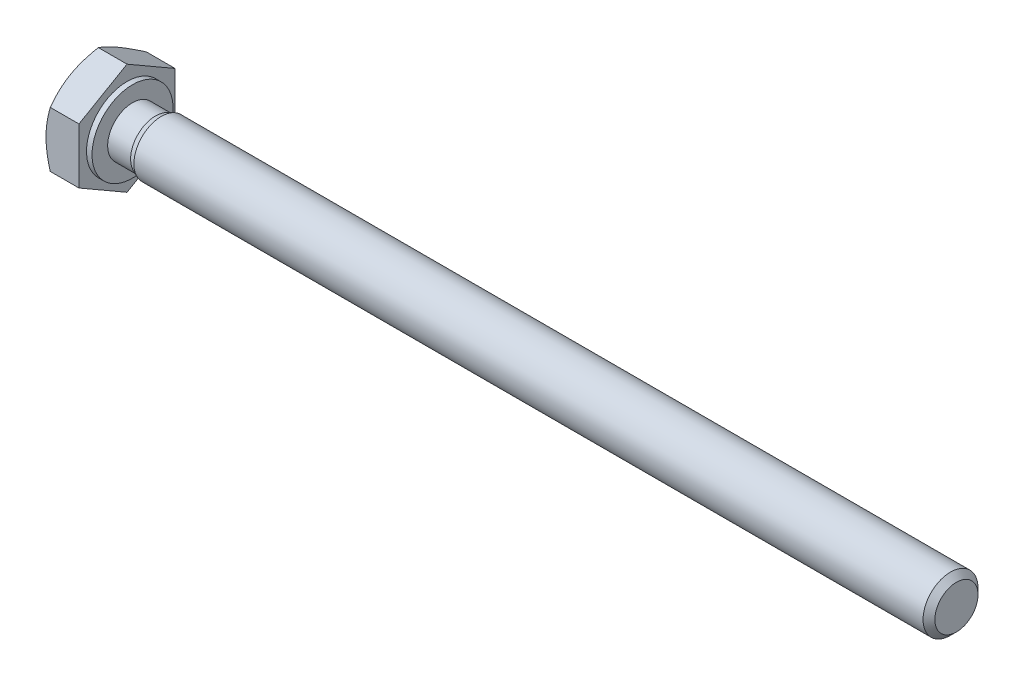
ISO-10303-21;
HEADER;
FILE_DESCRIPTION(('STEP AP214'),'2;1');
FILE_NAME('part.step','',(''),(''),'','','');
FILE_SCHEMA(('AUTOMOTIVE_DESIGN { 1 0 10303 214 1 1 1 1 }'));
ENDSEC;
DATA;
#1=APPLICATION_CONTEXT('core data for automotive mechanical design processes');
#2=APPLICATION_PROTOCOL_DEFINITION('international standard','automotive_design',2000,#1);
#3=PRODUCT_CONTEXT('',#1,'mechanical');
#4=PRODUCT('Part','Part','',(#3));
#5=PRODUCT_RELATED_PRODUCT_CATEGORY('part','',(#4));
#6=PRODUCT_DEFINITION_FORMATION('','',#4);
#7=PRODUCT_DEFINITION_CONTEXT('part definition',#1,'design');
#8=PRODUCT_DEFINITION('design','',#6,#7);
#9=PRODUCT_DEFINITION_SHAPE('','',#8);
#10=(LENGTH_UNIT() NAMED_UNIT(*) SI_UNIT(.MILLI.,.METRE.));
#11=(NAMED_UNIT(*) PLANE_ANGLE_UNIT() SI_UNIT($,.RADIAN.));
#12=(NAMED_UNIT(*) SI_UNIT($,.STERADIAN.) SOLID_ANGLE_UNIT());
#13=UNCERTAINTY_MEASURE_WITH_UNIT(LENGTH_MEASURE(1.E-05),#10,'distance_accuracy_value','');
#14=(GEOMETRIC_REPRESENTATION_CONTEXT(3) GLOBAL_UNCERTAINTY_ASSIGNED_CONTEXT((#13)) GLOBAL_UNIT_ASSIGNED_CONTEXT((#10,
#11,#12)) REPRESENTATION_CONTEXT('',''));
#15=CARTESIAN_POINT('',(0.,0.,0.));
#16=DIRECTION('',(0.,0.,1.));
#17=DIRECTION('',(1.,0.,0.));
#18=AXIS2_PLACEMENT_3D('',#15,#16,#17);
#19=CARTESIAN_POINT('',(-2.80009999999999,0.,0.));
#20=DIRECTION('',(1.,0.,0.));
#21=DIRECTION('',(0.,1.,0.));
#22=AXIS2_PLACEMENT_3D('',#19,#20,#21);
#23=PLANE('',#22);
#24=CARTESIAN_POINT('',(-2.80010000001698,0.,0.));
#25=DIRECTION('',(1.,0.,0.));
#26=DIRECTION('',(0.,0.,-1.));
#27=AXIS2_PLACEMENT_3D('',#24,#25,#26);
#28=CIRCLE('',#27,3.49999999997408);
#29=CARTESIAN_POINT('',(-2.8001000000095,3.03108891323431,-1.74999999999352));
#30=VERTEX_POINT('',#29);
#31=CARTESIAN_POINT('',(-2.8001000000095,3.03108891323431,1.74999999999352));
#32=VERTEX_POINT('',#31);
#33=EDGE_CURVE('E372',#30,#32,#28,.T.);
#34=ORIENTED_EDGE('',*,*,#33,.F.);
#35=CARTESIAN_POINT('',(-2.80010000001698,0.,0.));
#36=DIRECTION('',(1.,0.,0.));
#37=DIRECTION('',(0.,0.,-1.));
#38=AXIS2_PLACEMENT_3D('',#35,#36,#37);
#39=CIRCLE('',#38,3.49999999997408);
#40=CARTESIAN_POINT('',(-2.8001000000095,0.,-3.49999999998704));
#41=VERTEX_POINT('',#40);
#42=EDGE_CURVE('E368',#41,#30,#39,.T.);
#43=ORIENTED_EDGE('',*,*,#42,.F.);
#44=CARTESIAN_POINT('',(-2.80010000001698,0.,0.));
#45=DIRECTION('',(1.,0.,0.));
#46=DIRECTION('',(0.,0.,-1.));
#47=AXIS2_PLACEMENT_3D('',#44,#45,#46);
#48=CIRCLE('',#47,3.49999999997408);
#49=CARTESIAN_POINT('',(-2.8001000000095,-3.03108891323431,-1.74999999999352));
#50=VERTEX_POINT('',#49);
#51=EDGE_CURVE('E364',#50,#41,#48,.T.);
#52=ORIENTED_EDGE('',*,*,#51,.F.);
#53=CARTESIAN_POINT('',(-2.80010000001698,0.,0.));
#54=DIRECTION('',(1.,0.,0.));
#55=DIRECTION('',(0.,0.,-1.));
#56=AXIS2_PLACEMENT_3D('',#53,#54,#55);
#57=CIRCLE('',#56,3.49999999997408);
#58=CARTESIAN_POINT('',(-2.8001000000095,-3.03108891323431,1.74999999999352));
#59=VERTEX_POINT('',#58);
#60=EDGE_CURVE('E91',#59,#50,#57,.T.);
#61=ORIENTED_EDGE('',*,*,#60,.F.);
#62=CARTESIAN_POINT('',(-2.80010000001698,0.,0.));
#63=DIRECTION('',(1.,0.,0.));
#64=DIRECTION('',(0.,0.,-1.));
#65=AXIS2_PLACEMENT_3D('',#62,#63,#64);
#66=CIRCLE('',#65,3.49999999997408);
#67=CARTESIAN_POINT('',(-2.8001000000095,0.,3.49999999998704));
#68=VERTEX_POINT('',#67);
#69=EDGE_CURVE('E88',#68,#59,#66,.T.);
#70=ORIENTED_EDGE('',*,*,#69,.F.);
#71=CARTESIAN_POINT('',(-2.80010000001698,0.,0.));
#72=DIRECTION('',(1.,0.,0.));
#73=DIRECTION('',(0.,0.,-1.));
#74=AXIS2_PLACEMENT_3D('',#71,#72,#73);
#75=CIRCLE('',#74,3.49999999997408);
#76=EDGE_CURVE('E20',#32,#68,#75,.T.);
#77=ORIENTED_EDGE('',*,*,#76,.F.);
#78=EDGE_LOOP('',(#34,#43,#52,#61,#70,#77));
#79=FACE_BOUND('',#78,.T.);
#80=ADVANCED_FACE('F17',(#79),#23,.F.);
#81=CARTESIAN_POINT('',(-2.48561696463412,0.,0.));
#82=DIRECTION('',(1.,0.,0.));
#83=DIRECTION('',(0.,0.,-1.));
#84=AXIS2_PLACEMENT_3D('',#81,#82,#83);
#85=CONICAL_SURFACE('',#84,4.04470059538653,1.04719755120523);
#86=ORIENTED_EDGE('',*,*,#76,.T.);
#87=CARTESIAN_POINT('',(-2.48749260883797,2.02072594216586,3.5));
#88=CARTESIAN_POINT('',(-2.53498760588299,1.85623971145421,3.5));
#89=CARTESIAN_POINT('',(-2.57850131522338,1.69043621589809,3.5));
#90=CARTESIAN_POINT('',(-2.65523695818825,1.35736768336483,3.5));
#91=CARTESIAN_POINT('',(-2.68850978240536,1.19011426411847,3.5));
#92=CARTESIAN_POINT('',(-2.72936316154827,0.937655668885754,3.5));
#93=CARTESIAN_POINT('',(-2.74147660437875,0.853183894577956,3.5));
#94=CARTESIAN_POINT('',(-2.7624452264286,0.683835945146513,3.5));
#95=CARTESIAN_POINT('',(-2.77130049140569,0.598959780726294,3.5));
#96=CARTESIAN_POINT('',(-2.78559717089421,0.428489104641917,3.5));
#97=CARTESIAN_POINT('',(-2.7910212245218,0.342893125795462,3.5));
#98=CARTESIAN_POINT('',(-2.79828014667388,0.171532828534741,3.5));
#99=CARTESIAN_POINT('',(-2.80011430437159,0.0857684801466129,3.5));
#100=CARTESIAN_POINT('',(-2.80010000000202,0.,3.5));
#101=B_SPLINE_CURVE_WITH_KNOTS('',3,(#87,#88,#89,#90,#91,#92,#93,#94,#95,#96,#97,#98,#99,#100),
.UNSPECIFIED.,.F.,.F.,(4,2,2,2,2,2,4),(0.,0.513825660873702,1.02505510269113,1.28100524354765,
1.53694864711989,1.79417690106573,2.05145608301609),.UNSPECIFIED.);
#102=CARTESIAN_POINT('',(-2.48749260883797,2.02072594216422,3.50000000000095));
#103=VERTEX_POINT('',#102);
#104=EDGE_CURVE('E109',#103,#68,#101,.T.);
#105=ORIENTED_EDGE('',*,*,#104,.F.);
#106=CARTESIAN_POINT('',(-2.80010000000202,3.03108891324553,1.75));
#107=CARTESIAN_POINT('',(-2.80011430437159,2.98820467317223,1.82427768265095));
#108=CARTESIAN_POINT('',(-2.79828014667388,2.94532249897816,1.89855178709409));
#109=CARTESIAN_POINT('',(-2.7910212245218,2.8596423503478,2.04695415772193));
#110=CARTESIAN_POINT('',(-2.78559717089421,2.81684436092457,2.12108244986476));
#111=CARTESIAN_POINT('',(-2.77130049140569,2.73160902288238,2.26871438595414));
#112=CARTESIAN_POINT('',(-2.7624452264286,2.68917094067227,2.34221930051783));
#113=CARTESIAN_POINT('',(-2.74147660437875,2.60449696595655,2.48887892680427));
#114=CARTESIAN_POINT('',(-2.72936316154827,2.56226107880265,2.56203362925757));
#115=CARTESIAN_POINT('',(-2.68850978240536,2.43603178118629,2.78066918613283));
#116=CARTESIAN_POINT('',(-2.65523695818825,2.3524050715631,2.92551489607));
#117=CARTESIAN_POINT('',(-2.57850131522337,2.18587080529647,3.213960706445));
#118=CARTESIAN_POINT('',(-2.53498760588299,2.10296905751841,3.35755074563286));
#119=CARTESIAN_POINT('',(-2.48749260883797,2.02072594216258,3.50000000000191));
#120=B_SPLINE_CURVE_WITH_KNOTS('',3,(#106,#107,#108,#109,#110,#111,#112,#113,#114,#115,#116,
#117,#118,#119),.UNSPECIFIED.,.F.,.F.,(4,2,2,2,2,2,4),(0.,0.257279181950367,0.514507435896208,
0.770450839468459,1.02640098032498,1.53763042214241,2.05145608301612),.UNSPECIFIED.);
#121=EDGE_CURVE('E103',#32,#103,#120,.T.);
#122=ORIENTED_EDGE('',*,*,#121,.F.);
#123=EDGE_LOOP('',(#86,#105,#122));
#124=FACE_BOUND('',#123,.T.);
#125=ADVANCED_FACE('F108',(#124),#85,.T.);
#126=CARTESIAN_POINT('',(-2.48561696463412,0.,0.));
#127=DIRECTION('',(1.,0.,0.));
#128=DIRECTION('',(0.,0.,-1.));
#129=AXIS2_PLACEMENT_3D('',#126,#127,#128);
#130=CONICAL_SURFACE('',#129,4.04470059538653,1.04719755120523);
#131=CARTESIAN_POINT('',(-2.80010000000202,0.,3.5));
#132=CARTESIAN_POINT('',(-2.80011430437159,-0.085768480146616,3.5));
#133=CARTESIAN_POINT('',(-2.79828014667387,-0.171532828534744,3.5));
#134=CARTESIAN_POINT('',(-2.7910212245218,-0.342893125795465,3.5));
#135=CARTESIAN_POINT('',(-2.78559717089421,-0.42848910464192,3.5));
#136=CARTESIAN_POINT('',(-2.77130049140569,-0.598959780726298,3.5));
#137=CARTESIAN_POINT('',(-2.7624452264286,-0.683835945146517,3.5));
#138=CARTESIAN_POINT('',(-2.74147660437875,-0.85318389457796,3.5));
#139=CARTESIAN_POINT('',(-2.72936316154827,-0.937655668885758,3.5));
#140=CARTESIAN_POINT('',(-2.68850978240536,-1.19011426411847,3.5));
#141=CARTESIAN_POINT('',(-2.65523695818825,-1.35736768336484,3.5));
#142=CARTESIAN_POINT('',(-2.57850131522338,-1.69043621589809,3.5));
#143=CARTESIAN_POINT('',(-2.53498760588299,-1.85623971145421,3.5));
#144=CARTESIAN_POINT('',(-2.48749260883797,-2.02072594216587,3.5));
#145=B_SPLINE_CURVE_WITH_KNOTS('',3,(#131,#132,#133,#134,#135,#136,#137,#138,#139,#140,#141,
#142,#143,#144),.UNSPECIFIED.,.F.,.F.,(4,2,2,2,2,2,4),(0.,0.257279181950363,0.5145074358962,
0.770450839468448,1.02640098032496,1.53763042214239,2.0514560830161),.UNSPECIFIED.);
#146=CARTESIAN_POINT('',(-2.48749260883797,-2.02072594216423,3.50000000000095));
#147=VERTEX_POINT('',#146);
#148=EDGE_CURVE('E96',#68,#147,#145,.T.);
#149=ORIENTED_EDGE('',*,*,#148,.F.);
#150=ORIENTED_EDGE('',*,*,#69,.T.);
#151=CARTESIAN_POINT('',(-2.48749260883796,-2.02072594216259,3.50000000000191));
#152=CARTESIAN_POINT('',(-2.53498760588298,-2.10296905751842,3.35755074563287));
#153=CARTESIAN_POINT('',(-2.57850131522337,-2.18587080529648,3.21396070644501));
#154=CARTESIAN_POINT('',(-2.65523695818825,-2.35240507156311,2.92551489607));
#155=CARTESIAN_POINT('',(-2.68850978240535,-2.43603178118629,2.78066918613284));
#156=CARTESIAN_POINT('',(-2.72936316154827,-2.56226107880265,2.56203362925757));
#157=CARTESIAN_POINT('',(-2.74147660437875,-2.60449696595655,2.48887892680427));
#158=CARTESIAN_POINT('',(-2.7624452264286,-2.68917094067227,2.34221930051784));
#159=CARTESIAN_POINT('',(-2.77130049140569,-2.73160902288238,2.26871438595414));
#160=CARTESIAN_POINT('',(-2.78559717089421,-2.81684436092457,2.12108244986476));
#161=CARTESIAN_POINT('',(-2.7910212245218,-2.8596423503478,2.04695415772193));
#162=CARTESIAN_POINT('',(-2.79828014667387,-2.94532249897816,1.89855178709409));
#163=CARTESIAN_POINT('',(-2.80011430437159,-2.98820467317223,1.82427768265095));
#164=CARTESIAN_POINT('',(-2.80010000000201,-3.03108891324553,1.75));
#165=B_SPLINE_CURVE_WITH_KNOTS('',3,(#151,#152,#153,#154,#155,#156,#157,#158,#159,#160,#161,
#162,#163,#164),.UNSPECIFIED.,.F.,.F.,(4,2,2,2,2,2,4),(0.,0.513825660873709,1.02505510269114,
1.28100524354766,1.53694864711991,1.79417690106576,2.05145608301612),.UNSPECIFIED.);
#166=EDGE_CURVE('E98',#147,#59,#165,.T.);
#167=ORIENTED_EDGE('',*,*,#166,.F.);
#168=EDGE_LOOP('',(#149,#150,#167));
#169=FACE_BOUND('',#168,.T.);
#170=ADVANCED_FACE('F97',(#169),#130,.T.);
#171=CARTESIAN_POINT('',(-2.48561696463412,0.,0.));
#172=DIRECTION('',(1.,0.,0.));
#173=DIRECTION('',(0.,0.,-1.));
#174=AXIS2_PLACEMENT_3D('',#171,#172,#173);
#175=CONICAL_SURFACE('',#174,4.04470059538653,1.04719755120523);
#176=CARTESIAN_POINT('',(-2.80010000000201,-3.03108891324553,1.75));
#177=CARTESIAN_POINT('',(-2.80011430437159,-3.07397315331884,1.67572231734905));
#178=CARTESIAN_POINT('',(-2.79828014667387,-3.11685532751291,1.60144821290592));
#179=CARTESIAN_POINT('',(-2.7910212245218,-3.20253547614327,1.45304584227808));
#180=CARTESIAN_POINT('',(-2.78559717089421,-3.24533346556649,1.37891755013525));
#181=CARTESIAN_POINT('',(-2.77130049140569,-3.33056880360868,1.23128561404587));
#182=CARTESIAN_POINT('',(-2.7624452264286,-3.37300688581879,1.15778069948218));
#183=CARTESIAN_POINT('',(-2.74147660437875,-3.45768086053451,1.01112107319574));
#184=CARTESIAN_POINT('',(-2.72936316154827,-3.49991674768841,0.937966370742446));
#185=CARTESIAN_POINT('',(-2.68850978240536,-3.62614604530477,0.719330813867181));
#186=CARTESIAN_POINT('',(-2.65523695818825,-3.70977275492795,0.574485103930018));
#187=CARTESIAN_POINT('',(-2.57850131522338,-3.87630702119458,0.286039293555015));
#188=CARTESIAN_POINT('',(-2.53498760588299,-3.95920876897264,0.142449254367156));
#189=CARTESIAN_POINT('',(-2.48749260883797,-4.04145188432847,-1.88510767100038E-12));
#190=B_SPLINE_CURVE_WITH_KNOTS('',3,(#176,#177,#178,#179,#180,#181,#182,#183,#184,#185,#186,
#187,#188,#189),.UNSPECIFIED.,.F.,.F.,(4,2,2,2,2,2,4),(0.,0.257279181950364,0.514507435896202,
0.77045083946845,1.02640098032497,1.5376304221424,2.0514560830161),.UNSPECIFIED.);
#191=CARTESIAN_POINT('',(-2.48749260883797,-4.04145188432847,0.));
#192=VERTEX_POINT('',#191);
#193=EDGE_CURVE('E114',#59,#192,#190,.T.);
#194=ORIENTED_EDGE('',*,*,#193,.F.);
#195=ORIENTED_EDGE('',*,*,#60,.T.);
#196=CARTESIAN_POINT('',(-2.48749260883796,-4.04145188432848,1.90549218164857E-12));
#197=CARTESIAN_POINT('',(-2.53498760588298,-3.95920876897265,-0.142449254367138));
#198=CARTESIAN_POINT('',(-2.57850131522337,-3.87630702119459,-0.286039293554998));
#199=CARTESIAN_POINT('',(-2.65523695818825,-3.70977275492796,-0.574485103930004));
#200=CARTESIAN_POINT('',(-2.68850978240535,-3.62614604530478,-0.719330813867169));
#201=CARTESIAN_POINT('',(-2.72936316154827,-3.49991674768842,-0.937966370742436));
#202=CARTESIAN_POINT('',(-2.74147660437875,-3.45768086053452,-1.01112107319574));
#203=CARTESIAN_POINT('',(-2.7624452264286,-3.3730068858188,-1.15778069948217));
#204=CARTESIAN_POINT('',(-2.77130049140569,-3.33056880360869,-1.23128561404587));
#205=CARTESIAN_POINT('',(-2.78559717089421,-3.2453334655665,-1.37891755013525));
#206=CARTESIAN_POINT('',(-2.7910212245218,-3.20253547614327,-1.45304584227807));
#207=CARTESIAN_POINT('',(-2.79828014667387,-3.11685532751291,-1.60144821290591));
#208=CARTESIAN_POINT('',(-2.80011430437159,-3.07397315331884,-1.67572231734905));
#209=CARTESIAN_POINT('',(-2.80010000000201,-3.03108891324553,-1.75));
#210=B_SPLINE_CURVE_WITH_KNOTS('',3,(#196,#197,#198,#199,#200,#201,#202,#203,#204,#205,#206,
#207,#208,#209),.UNSPECIFIED.,.F.,.F.,(4,2,2,2,2,2,4),(0.,0.51382566087371,1.02505510269115,
1.28100524354767,1.53694864711992,1.79417690106576,2.05145608301613),.UNSPECIFIED.);
#211=EDGE_CURVE('E208',#192,#50,#210,.T.);
#212=ORIENTED_EDGE('',*,*,#211,.F.);
#213=EDGE_LOOP('',(#194,#195,#212));
#214=FACE_BOUND('',#213,.T.);
#215=ADVANCED_FACE('F216',(#214),#175,.T.);
#216=CARTESIAN_POINT('',(-2.48561696463412,0.,0.));
#217=DIRECTION('',(1.,0.,0.));
#218=DIRECTION('',(0.,0.,-1.));
#219=AXIS2_PLACEMENT_3D('',#216,#217,#218);
#220=CONICAL_SURFACE('',#219,4.04470059538653,1.04719755120523);
#221=CARTESIAN_POINT('',(-2.80010000000201,-3.03108891324553,-1.75));
#222=CARTESIAN_POINT('',(-2.80011430437159,-2.98820467317223,-1.82427768265095));
#223=CARTESIAN_POINT('',(-2.79828014667387,-2.94532249897816,-1.89855178709409));
#224=CARTESIAN_POINT('',(-2.7910212245218,-2.8596423503478,-2.04695415772193));
#225=CARTESIAN_POINT('',(-2.78559717089421,-2.81684436092458,-2.12108244986475));
#226=CARTESIAN_POINT('',(-2.77130049140569,-2.73160902288239,-2.26871438595413));
#227=CARTESIAN_POINT('',(-2.7624452264286,-2.68917094067228,-2.34221930051783));
#228=CARTESIAN_POINT('',(-2.74147660437875,-2.60449696595655,-2.48887892680426));
#229=CARTESIAN_POINT('',(-2.72936316154827,-2.56226107880266,-2.56203362925756));
#230=CARTESIAN_POINT('',(-2.68850978240536,-2.4360317811863,-2.78066918613282));
#231=CARTESIAN_POINT('',(-2.65523695818825,-2.35240507156312,-2.92551489606998));
#232=CARTESIAN_POINT('',(-2.57850131522338,-2.18587080529649,-3.21396070644498));
#233=CARTESIAN_POINT('',(-2.53498760588299,-2.10296905751843,-3.35755074563284));
#234=CARTESIAN_POINT('',(-2.48749260883797,-2.0207259421626,-3.50000000000188));
#235=B_SPLINE_CURVE_WITH_KNOTS('',3,(#221,#222,#223,#224,#225,#226,#227,#228,#229,#230,#231,
#232,#233,#234),.UNSPECIFIED.,.F.,.F.,(4,2,2,2,2,2,4),(0.,0.257279181950364,0.5145074358962,
0.770450839468447,1.02640098032496,1.53763042214239,2.05145608301609),.UNSPECIFIED.);
#236=CARTESIAN_POINT('',(-2.48749260883797,-2.02072594216425,-3.50000000000094));
#237=VERTEX_POINT('',#236);
#238=EDGE_CURVE('E220',#50,#237,#235,.T.);
#239=ORIENTED_EDGE('',*,*,#238,.F.);
#240=ORIENTED_EDGE('',*,*,#51,.T.);
#241=CARTESIAN_POINT('',(-2.48749260883796,-2.02072594216589,-3.5));
#242=CARTESIAN_POINT('',(-2.53498760588298,-1.85623971145424,-3.5));
#243=CARTESIAN_POINT('',(-2.57850131522337,-1.69043621589812,-3.5));
#244=CARTESIAN_POINT('',(-2.65523695818825,-1.35736768336486,-3.5));
#245=CARTESIAN_POINT('',(-2.68850978240536,-1.19011426411849,-3.5));
#246=CARTESIAN_POINT('',(-2.72936316154827,-0.937655668885769,-3.5));
#247=CARTESIAN_POINT('',(-2.74147660437875,-0.853183894577971,-3.5));
#248=CARTESIAN_POINT('',(-2.7624452264286,-0.683835945146524,-3.5));
#249=CARTESIAN_POINT('',(-2.77130049140569,-0.598959780726304,-3.5));
#250=CARTESIAN_POINT('',(-2.78559717089421,-0.428489104641924,-3.5));
#251=CARTESIAN_POINT('',(-2.7910212245218,-0.342893125795468,-3.5));
#252=CARTESIAN_POINT('',(-2.79828014667387,-0.171532828534745,-3.5));
#253=CARTESIAN_POINT('',(-2.80011430437159,-0.085768480146615,-3.5));
#254=CARTESIAN_POINT('',(-2.80010000000201,0.,-3.5));
#255=B_SPLINE_CURVE_WITH_KNOTS('',3,(#241,#242,#243,#244,#245,#246,#247,#248,#249,#250,#251,
#252,#253,#254),.UNSPECIFIED.,.F.,.F.,(4,2,2,2,2,2,4),(0.,0.51382566087371,1.02505510269115,
1.28100524354767,1.53694864711992,1.79417690106576,2.05145608301613),.UNSPECIFIED.);
#256=EDGE_CURVE('E202',#237,#41,#255,.T.);
#257=ORIENTED_EDGE('',*,*,#256,.F.);
#258=EDGE_LOOP('',(#239,#240,#257));
#259=FACE_BOUND('',#258,.T.);
#260=ADVANCED_FACE('F213',(#259),#220,.T.);
#261=CARTESIAN_POINT('',(-2.48561696463412,0.,0.));
#262=DIRECTION('',(1.,0.,0.));
#263=DIRECTION('',(0.,0.,-1.));
#264=AXIS2_PLACEMENT_3D('',#261,#262,#263);
#265=CONICAL_SURFACE('',#264,4.04470059538653,1.04719755120523);
#266=ORIENTED_EDGE('',*,*,#42,.T.);
#267=CARTESIAN_POINT('',(-2.48749260883796,2.02072594216259,-3.50000000000191));
#268=CARTESIAN_POINT('',(-2.53498760588298,2.10296905751842,-3.35755074563287));
#269=CARTESIAN_POINT('',(-2.57850131522337,2.18587080529648,-3.21396070644501));
#270=CARTESIAN_POINT('',(-2.65523695818825,2.3524050715631,-2.92551489607));
#271=CARTESIAN_POINT('',(-2.68850978240535,2.43603178118629,-2.78066918613283));
#272=CARTESIAN_POINT('',(-2.72936316154827,2.56226107880265,-2.56203362925757));
#273=CARTESIAN_POINT('',(-2.74147660437875,2.60449696595655,-2.48887892680427));
#274=CARTESIAN_POINT('',(-2.7624452264286,2.68917094067227,-2.34221930051783));
#275=CARTESIAN_POINT('',(-2.77130049140569,2.73160902288238,-2.26871438595414));
#276=CARTESIAN_POINT('',(-2.78559717089421,2.81684436092457,-2.12108244986476));
#277=CARTESIAN_POINT('',(-2.7910212245218,2.8596423503478,-2.04695415772193));
#278=CARTESIAN_POINT('',(-2.79828014667387,2.94532249897816,-1.89855178709409));
#279=CARTESIAN_POINT('',(-2.80011430437159,2.98820467317222,-1.82427768265095));
#280=CARTESIAN_POINT('',(-2.80010000000202,3.03108891324553,-1.75));
#281=B_SPLINE_CURVE_WITH_KNOTS('',3,(#267,#268,#269,#270,#271,#272,#273,#274,#275,#276,#277,
#278,#279,#280),.UNSPECIFIED.,.F.,.F.,(4,2,2,2,2,2,4),(0.,0.513825660873709,1.02505510269114,
1.28100524354766,1.53694864711992,1.79417690106576,2.05145608301612),.UNSPECIFIED.);
#282=CARTESIAN_POINT('',(-2.48749260883797,2.02072594216423,-3.50000000000095));
#283=VERTEX_POINT('',#282);
#284=EDGE_CURVE('E174',#283,#30,#281,.T.);
#285=ORIENTED_EDGE('',*,*,#284,.F.);
#286=CARTESIAN_POINT('',(-2.80010000000201,0.,-3.5));
#287=CARTESIAN_POINT('',(-2.80011430437159,0.0857684801466146,-3.5));
#288=CARTESIAN_POINT('',(-2.79828014667387,0.171532828534743,-3.5));
#289=CARTESIAN_POINT('',(-2.7910212245218,0.342893125795464,-3.5));
#290=CARTESIAN_POINT('',(-2.78559717089421,0.428489104641919,-3.5));
#291=CARTESIAN_POINT('',(-2.77130049140569,0.598959780726297,-3.5));
#292=CARTESIAN_POINT('',(-2.7624452264286,0.683835945146516,-3.5));
#293=CARTESIAN_POINT('',(-2.74147660437875,0.85318389457796,-3.5));
#294=CARTESIAN_POINT('',(-2.72936316154827,0.937655668885757,-3.5));
#295=CARTESIAN_POINT('',(-2.68850978240536,1.19011426411847,-3.5));
#296=CARTESIAN_POINT('',(-2.65523695818825,1.35736768336484,-3.5));
#297=CARTESIAN_POINT('',(-2.57850131522338,1.69043621589809,-3.5));
#298=CARTESIAN_POINT('',(-2.53498760588299,1.85623971145421,-3.5));
#299=CARTESIAN_POINT('',(-2.48749260883797,2.02072594216587,-3.5));
#300=B_SPLINE_CURVE_WITH_KNOTS('',3,(#286,#287,#288,#289,#290,#291,#292,#293,#294,#295,#296,
#297,#298,#299),.UNSPECIFIED.,.F.,.F.,(4,2,2,2,2,2,4),(0.,0.257279181950364,0.514507435896201,
0.770450839468448,1.02640098032496,1.53763042214239,2.0514560830161),.UNSPECIFIED.);
#301=EDGE_CURVE('E197',#41,#283,#300,.T.);
#302=ORIENTED_EDGE('',*,*,#301,.F.);
#303=EDGE_LOOP('',(#266,#285,#302));
#304=FACE_BOUND('',#303,.T.);
#305=ADVANCED_FACE('F159',(#304),#265,.T.);
#306=CARTESIAN_POINT('',(-2.48561696463412,0.,0.));
#307=DIRECTION('',(1.,0.,0.));
#308=DIRECTION('',(0.,0.,-1.));
#309=AXIS2_PLACEMENT_3D('',#306,#307,#308);
#310=CONICAL_SURFACE('',#309,4.04470059538653,1.04719755120523);
#311=ORIENTED_EDGE('',*,*,#33,.T.);
#312=CARTESIAN_POINT('',(-2.48749260883797,4.04145188432848,-1.89469704332326E-12));
#313=CARTESIAN_POINT('',(-2.53498760588299,3.95920876897265,0.142449254367147));
#314=CARTESIAN_POINT('',(-2.57850131522337,3.87630702119459,0.286039293555007));
#315=CARTESIAN_POINT('',(-2.65523695818825,3.70977275492796,0.57448510393001));
#316=CARTESIAN_POINT('',(-2.68850978240536,3.62614604530477,0.719330813867175));
#317=CARTESIAN_POINT('',(-2.72936316154827,3.49991674768842,0.93796637074244));
#318=CARTESIAN_POINT('',(-2.74147660437875,3.45768086053452,1.01112107319574));
#319=CARTESIAN_POINT('',(-2.7624452264286,3.37300688581879,1.15778069948217));
#320=CARTESIAN_POINT('',(-2.77130049140569,3.33056880360868,1.23128561404587));
#321=CARTESIAN_POINT('',(-2.78559717089421,3.24533346556649,1.37891755013525));
#322=CARTESIAN_POINT('',(-2.7910212245218,3.20253547614327,1.45304584227807));
#323=CARTESIAN_POINT('',(-2.79828014667387,3.11685532751291,1.60144821290591));
#324=CARTESIAN_POINT('',(-2.80011430437159,3.07397315331884,1.67572231734905));
#325=CARTESIAN_POINT('',(-2.80010000000202,3.03108891324553,1.75));
#326=B_SPLINE_CURVE_WITH_KNOTS('',3,(#312,#313,#314,#315,#316,#317,#318,#319,#320,#321,#322,
#323,#324,#325),.UNSPECIFIED.,.F.,.F.,(4,2,2,2,2,2,4),(0.,0.513825660873707,1.02505510269114,
1.28100524354766,1.53694864711991,1.79417690106575,2.05145608301611),.UNSPECIFIED.);
#327=CARTESIAN_POINT('',(-2.48749260883829,4.04145188432793,-9.51148669664066E-13));
#328=VERTEX_POINT('',#327);
#329=EDGE_CURVE('E144',#328,#32,#326,.T.);
#330=ORIENTED_EDGE('',*,*,#329,.F.);
#331=CARTESIAN_POINT('',(-2.80010000000201,3.03108891324553,-1.75));
#332=CARTESIAN_POINT('',(-2.80011430437159,3.07397315331884,-1.67572231734905));
#333=CARTESIAN_POINT('',(-2.79828014667388,3.11685532751291,-1.60144821290591));
#334=CARTESIAN_POINT('',(-2.7910212245218,3.20253547614327,-1.45304584227807));
#335=CARTESIAN_POINT('',(-2.78559717089421,3.24533346556649,-1.37891755013525));
#336=CARTESIAN_POINT('',(-2.77130049140569,3.33056880360868,-1.23128561404587));
#337=CARTESIAN_POINT('',(-2.7624452264286,3.37300688581879,-1.15778069948217));
#338=CARTESIAN_POINT('',(-2.74147660437875,3.45768086053452,-1.01112107319574));
#339=CARTESIAN_POINT('',(-2.72936316154827,3.49991674768841,-0.937966370742441));
#340=CARTESIAN_POINT('',(-2.68850978240536,3.62614604530477,-0.719330813867175));
#341=CARTESIAN_POINT('',(-2.65523695818825,3.70977275492796,-0.574485103930011));
#342=CARTESIAN_POINT('',(-2.57850131522337,3.87630702119459,-0.286039293555007));
#343=CARTESIAN_POINT('',(-2.53498760588299,3.95920876897264,-0.142449254367147));
#344=CARTESIAN_POINT('',(-2.48749260883797,4.04145188432847,1.89478551940359E-12));
#345=B_SPLINE_CURVE_WITH_KNOTS('',3,(#331,#332,#333,#334,#335,#336,#337,#338,#339,#340,#341,
#342,#343,#344),.UNSPECIFIED.,.F.,.F.,(4,2,2,2,2,2,4),(0.,0.257279181950366,0.514507435896205,
0.770450839468454,1.02640098032497,1.53763042214241,2.05145608301611),.UNSPECIFIED.);
#346=EDGE_CURVE('E165',#30,#328,#345,.T.);
#347=ORIENTED_EDGE('',*,*,#346,.F.);
#348=EDGE_LOOP('',(#311,#330,#347));
#349=FACE_BOUND('',#348,.T.);
#350=ADVANCED_FACE('F153',(#349),#310,.T.);
#351=CARTESIAN_POINT('',(-0.400099999999994,4.04145188432738,0.));
#352=DIRECTION('',(0.,0.866025403784438,0.500000000000001));
#353=DIRECTION('',(0.,-0.500000000000001,0.866025403784438));
#354=AXIS2_PLACEMENT_3D('',#351,#352,#353);
#355=PLANE('',#354);
#356=DIRECTION('',(0.,-0.5,0.866025403784438));
#357=VECTOR('',#356,1.);
#358=CARTESIAN_POINT('',(-0.400099999999994,4.04145188432738,0.));
#359=LINE('',#358,#357);
#360=CARTESIAN_POINT('',(-0.400099999999994,4.04145188432738,0.));
#361=VERTEX_POINT('',#360);
#362=CARTESIAN_POINT('',(-0.400099999999993,2.02072594216369,3.5));
#363=VERTEX_POINT('',#362);
#364=EDGE_CURVE('E296',#361,#363,#359,.T.);
#365=ORIENTED_EDGE('',*,*,#364,.F.);
#366=DIRECTION('',(1.,0.,0.));
#367=VECTOR('',#366,1.);
#368=CARTESIAN_POINT('',(-0.400099999999994,4.04145188432738,0.));
#369=LINE('',#368,#367);
#370=EDGE_CURVE('E173',#328,#361,#369,.T.);
#371=ORIENTED_EDGE('',*,*,#370,.F.);
#372=ORIENTED_EDGE('',*,*,#329,.T.);
#373=ORIENTED_EDGE('',*,*,#121,.T.);
#374=DIRECTION('',(1.,0.,0.));
#375=VECTOR('',#374,1.);
#376=CARTESIAN_POINT('',(-0.400099999999994,2.02072594216369,3.5));
#377=LINE('',#376,#375);
#378=EDGE_CURVE('E102',#363,#103,#377,.F.);
#379=ORIENTED_EDGE('',*,*,#378,.F.);
#380=EDGE_LOOP('',(#365,#371,#372,#373,#379));
#381=FACE_BOUND('',#380,.T.);
#382=ADVANCED_FACE('F150',(#381),#355,.T.);
#383=CARTESIAN_POINT('',(-0.400099999999994,2.02072594216369,3.5));
#384=DIRECTION('',(0.,0.,1.));
#385=DIRECTION('',(0.,-1.,0.));
#386=AXIS2_PLACEMENT_3D('',#383,#384,#385);
#387=PLANE('',#386);
#388=ORIENTED_EDGE('',*,*,#378,.T.);
#389=ORIENTED_EDGE('',*,*,#104,.T.);
#390=ORIENTED_EDGE('',*,*,#148,.T.);
#391=DIRECTION('',(1.,0.,0.));
#392=VECTOR('',#391,1.);
#393=CARTESIAN_POINT('',(-0.400099999999993,-2.02072594216369,3.5));
#394=LINE('',#393,#392);
#395=CARTESIAN_POINT('',(-0.400099999999993,-2.02072594216369,3.5));
#396=VERTEX_POINT('',#395);
#397=EDGE_CURVE('E116',#396,#147,#394,.F.);
#398=ORIENTED_EDGE('',*,*,#397,.F.);
#399=DIRECTION('',(0.,1.,0.));
#400=VECTOR('',#399,1.);
#401=CARTESIAN_POINT('',(-0.400099999999993,0.,3.5));
#402=LINE('',#401,#400);
#403=EDGE_CURVE('E292',#363,#396,#402,.F.);
#404=ORIENTED_EDGE('',*,*,#403,.F.);
#405=EDGE_LOOP('',(#388,#389,#390,#398,#404));
#406=FACE_BOUND('',#405,.T.);
#407=ADVANCED_FACE('F112',(#406),#387,.T.);
#408=CARTESIAN_POINT('',(-0.400099999999993,-2.02072594216369,3.5));
#409=DIRECTION('',(0.,-0.866025403784439,0.5));
#410=DIRECTION('',(0.,-0.5,-0.866025403784439));
#411=AXIS2_PLACEMENT_3D('',#408,#409,#410);
#412=PLANE('',#411);
#413=ORIENTED_EDGE('',*,*,#397,.T.);
#414=ORIENTED_EDGE('',*,*,#166,.T.);
#415=ORIENTED_EDGE('',*,*,#193,.T.);
#416=DIRECTION('',(1.,0.,0.));
#417=VECTOR('',#416,1.);
#418=CARTESIAN_POINT('',(-0.400099999999993,-4.04145188432738,0.));
#419=LINE('',#418,#417);
#420=CARTESIAN_POINT('',(-0.400099999999993,-4.04145188432738,0.));
#421=VERTEX_POINT('',#420);
#422=EDGE_CURVE('E225',#421,#192,#419,.F.);
#423=ORIENTED_EDGE('',*,*,#422,.F.);
#424=DIRECTION('',(0.,-0.5,-0.866025403784439));
#425=VECTOR('',#424,1.);
#426=CARTESIAN_POINT('',(-0.400099999999993,-2.02072594216369,3.5));
#427=LINE('',#426,#425);
#428=EDGE_CURVE('E295',#396,#421,#427,.T.);
#429=ORIENTED_EDGE('',*,*,#428,.F.);
#430=EDGE_LOOP('',(#413,#414,#415,#423,#429));
#431=FACE_BOUND('',#430,.T.);
#432=ADVANCED_FACE('F229',(#431),#412,.T.);
#433=CARTESIAN_POINT('',(-0.400099999999993,-4.04145188432738,0.));
#434=DIRECTION('',(0.,-0.866025403784438,-0.5));
#435=DIRECTION('',(0.,0.5,-0.866025403784438));
#436=AXIS2_PLACEMENT_3D('',#433,#434,#435);
#437=PLANE('',#436);
#438=ORIENTED_EDGE('',*,*,#422,.T.);
#439=ORIENTED_EDGE('',*,*,#211,.T.);
#440=ORIENTED_EDGE('',*,*,#238,.T.);
#441=DIRECTION('',(1.,0.,0.));
#442=VECTOR('',#441,1.);
#443=CARTESIAN_POINT('',(-0.400099999999993,-2.02072594216369,-3.5));
#444=LINE('',#443,#442);
#445=CARTESIAN_POINT('',(-0.400099999999993,-2.02072594216369,-3.5));
#446=VERTEX_POINT('',#445);
#447=EDGE_CURVE('E330',#446,#237,#444,.F.);
#448=ORIENTED_EDGE('',*,*,#447,.F.);
#449=DIRECTION('',(0.,0.5,-0.866025403784438));
#450=VECTOR('',#449,1.);
#451=CARTESIAN_POINT('',(-0.400099999999993,-4.04145188432738,0.));
#452=LINE('',#451,#450);
#453=EDGE_CURVE('E301',#421,#446,#452,.T.);
#454=ORIENTED_EDGE('',*,*,#453,.F.);
#455=EDGE_LOOP('',(#438,#439,#440,#448,#454));
#456=FACE_BOUND('',#455,.T.);
#457=ADVANCED_FACE('F194',(#456),#437,.T.);
#458=CARTESIAN_POINT('',(-0.400099999999993,-2.02072594216369,-3.5));
#459=DIRECTION('',(0.,0.,-1.));
#460=DIRECTION('',(0.,1.,0.));
#461=AXIS2_PLACEMENT_3D('',#458,#459,#460);
#462=PLANE('',#461);
#463=DIRECTION('',(0.,1.,0.));
#464=VECTOR('',#463,1.);
#465=CARTESIAN_POINT('',(-0.400099999999993,0.,-3.5));
#466=LINE('',#465,#464);
#467=CARTESIAN_POINT('',(-0.400099999999994,2.02072594216369,-3.5));
#468=VERTEX_POINT('',#467);
#469=EDGE_CURVE('E306',#446,#468,#466,.T.);
#470=ORIENTED_EDGE('',*,*,#469,.F.);
#471=ORIENTED_EDGE('',*,*,#447,.T.);
#472=ORIENTED_EDGE('',*,*,#256,.T.);
#473=ORIENTED_EDGE('',*,*,#301,.T.);
#474=DIRECTION('',(1.,0.,0.));
#475=VECTOR('',#474,1.);
#476=CARTESIAN_POINT('',(-0.400099999999994,2.02072594216369,-3.5));
#477=LINE('',#476,#475);
#478=EDGE_CURVE('E35',#468,#283,#477,.F.);
#479=ORIENTED_EDGE('',*,*,#478,.F.);
#480=EDGE_LOOP('',(#470,#471,#472,#473,#479));
#481=FACE_BOUND('',#480,.T.);
#482=ADVANCED_FACE('F187',(#481),#462,.T.);
#483=CARTESIAN_POINT('',(-0.400099999999994,2.02072594216369,-3.5));
#484=DIRECTION('',(0.,0.866025403784439,-0.5));
#485=DIRECTION('',(0.,0.5,0.866025403784439));
#486=AXIS2_PLACEMENT_3D('',#483,#484,#485);
#487=PLANE('',#486);
#488=DIRECTION('',(0.,0.5,0.866025403784439));
#489=VECTOR('',#488,1.);
#490=CARTESIAN_POINT('',(-0.400099999999993,2.02072594216369,-3.5));
#491=LINE('',#490,#489);
#492=EDGE_CURVE('E285',#468,#361,#491,.T.);
#493=ORIENTED_EDGE('',*,*,#492,.F.);
#494=ORIENTED_EDGE('',*,*,#478,.T.);
#495=ORIENTED_EDGE('',*,*,#284,.T.);
#496=ORIENTED_EDGE('',*,*,#346,.T.);
#497=ORIENTED_EDGE('',*,*,#370,.T.);
#498=EDGE_LOOP('',(#493,#494,#495,#496,#497));
#499=FACE_BOUND('',#498,.T.);
#500=ADVANCED_FACE('F181',(#499),#487,.T.);
#501=CARTESIAN_POINT('',(-0.400099999999993,0.,0.));
#502=DIRECTION('',(1.,0.,0.));
#503=DIRECTION('',(0.,1.,0.));
#504=AXIS2_PLACEMENT_3D('',#501,#502,#503);
#505=PLANE('',#504);
#506=CARTESIAN_POINT('',(-0.400099999999994,0.,0.));
#507=DIRECTION('',(1.,0.,0.));
#508=DIRECTION('',(0.,1.,0.));
#509=AXIS2_PLACEMENT_3D('',#506,#507,#508);
#510=CIRCLE('',#509,2.95);
#511=CARTESIAN_POINT('',(-0.400099999999994,2.95,0.));
#512=VERTEX_POINT('',#511);
#513=EDGE_CURVE('E175',#512,#512,#510,.T.);
#514=ORIENTED_EDGE('',*,*,#513,.F.);
#515=EDGE_LOOP('',(#514));
#516=FACE_BOUND('',#515,.T.);
#517=ORIENTED_EDGE('',*,*,#469,.T.);
#518=ORIENTED_EDGE('',*,*,#492,.T.);
#519=ORIENTED_EDGE('',*,*,#364,.T.);
#520=ORIENTED_EDGE('',*,*,#403,.T.);
#521=ORIENTED_EDGE('',*,*,#428,.T.);
#522=ORIENTED_EDGE('',*,*,#453,.T.);
#523=EDGE_LOOP('',(#517,#518,#519,#520,#521,#522));
#524=FACE_BOUND('',#523,.T.);
#525=ADVANCED_FACE('F186',(#516,#524),#505,.T.);
#526=CARTESIAN_POINT('',(-0.200049999999994,0.,0.));
#527=DIRECTION('',(1.,0.,0.));
#528=DIRECTION('',(0.,1.,0.));
#529=AXIS2_PLACEMENT_3D('',#526,#527,#528);
#530=CYLINDRICAL_SURFACE('',#529,2.95);
#531=ORIENTED_EDGE('',*,*,#513,.T.);
#532=EDGE_LOOP('',(#531));
#533=FACE_BOUND('',#532,.T.);
#534=CARTESIAN_POINT('',(0.,0.,0.));
#535=DIRECTION('',(1.,0.,0.));
#536=DIRECTION('',(0.,1.,0.));
#537=AXIS2_PLACEMENT_3D('',#534,#535,#536);
#538=CIRCLE('',#537,2.95);
#539=CARTESIAN_POINT('',(0.,2.95,0.));
#540=VERTEX_POINT('',#539);
#541=EDGE_CURVE('E279',#540,#540,#538,.T.);
#542=ORIENTED_EDGE('',*,*,#541,.F.);
#543=EDGE_LOOP('',(#542));
#544=FACE_BOUND('',#543,.T.);
#545=ADVANCED_FACE('F266',(#533,#544),#530,.T.);
#546=CARTESIAN_POINT('',(0.,2.38027845,0.));
#547=DIRECTION('',(1.,0.,0.));
#548=DIRECTION('',(0.,1.,0.));
#549=AXIS2_PLACEMENT_3D('',#546,#547,#548);
#550=PLANE('',#549);
#551=CARTESIAN_POINT('',(0.,0.,0.));
#552=DIRECTION('',(1.,0.,0.));
#553=DIRECTION('',(0.,1.,0.));
#554=AXIS2_PLACEMENT_3D('',#551,#552,#553);
#555=CIRCLE('',#554,1.8105569);
#556=CARTESIAN_POINT('',(0.,1.8105569,0.));
#557=VERTEX_POINT('',#556);
#558=EDGE_CURVE('E281',#557,#557,#555,.T.);
#559=ORIENTED_EDGE('',*,*,#558,.F.);
#560=EDGE_LOOP('',(#559));
#561=FACE_BOUND('',#560,.T.);
#562=ORIENTED_EDGE('',*,*,#541,.T.);
#563=EDGE_LOOP('',(#562));
#564=FACE_BOUND('',#563,.T.);
#565=ADVANCED_FACE('F263',(#561,#564),#550,.T.);
#566=CARTESIAN_POINT('',(60.,1.00000000000001,0.));
#567=DIRECTION('',(1.,0.,0.));
#568=DIRECTION('',(0.,1.,0.));
#569=AXIS2_PLACEMENT_3D('',#566,#567,#568);
#570=PLANE('',#569);
#571=CARTESIAN_POINT('',(60.0000000000591,0.,0.));
#572=DIRECTION('',(-1.,0.,0.));
#573=DIRECTION('',(0.,0.,1.));
#574=AXIS2_PLACEMENT_3D('',#571,#572,#573);
#575=CIRCLE('',#574,1.57058499996764);
#576=CARTESIAN_POINT('',(60.0000000000591,0.,1.57058499996764));
#577=VERTEX_POINT('',#576);
#578=EDGE_CURVE('E283',#577,#577,#575,.T.);
#579=ORIENTED_EDGE('',*,*,#578,.F.);
#580=EDGE_LOOP('',(#579));
#581=FACE_BOUND('',#580,.T.);
#582=ADVANCED_FACE('F259',(#581),#570,.T.);
#583=CARTESIAN_POINT('',(0.835242500000009,0.,0.));
#584=DIRECTION('',(1.,0.,0.));
#585=DIRECTION('',(0.,1.,0.));
#586=AXIS2_PLACEMENT_3D('',#583,#584,#585);
#587=CYLINDRICAL_SURFACE('',#586,1.8105569);
#588=ORIENTED_EDGE('',*,*,#558,.T.);
#589=EDGE_LOOP('',(#588));
#590=FACE_BOUND('',#589,.T.);
#591=CARTESIAN_POINT('',(1.67048500003375,0.,0.));
#592=DIRECTION('',(1.,0.,0.));
#593=DIRECTION('',(0.,1.,0.));
#594=AXIS2_PLACEMENT_3D('',#591,#592,#593);
#595=CIRCLE('',#594,1.81055690003973);
#596=CARTESIAN_POINT('',(1.67048500003375,1.81055690003973,0.));
#597=VERTEX_POINT('',#596);
#598=EDGE_CURVE('E289',#597,#597,#595,.T.);
#599=ORIENTED_EDGE('',*,*,#598,.F.);
#600=EDGE_LOOP('',(#599));
#601=FACE_BOUND('',#600,.T.);
#602=ADVANCED_FACE('F255',(#590,#601),#587,.T.);
#603=CARTESIAN_POINT('',(59.5704850000516,0.,0.));
#604=DIRECTION('',(-1.,0.,0.));
#605=DIRECTION('',(0.,0.,1.));
#606=AXIS2_PLACEMENT_3D('',#603,#604,#605);
#607=CONICAL_SURFACE('',#606,2.00000000000956,0.78528173951521);
#608=CARTESIAN_POINT('',(59.570485,0.,0.));
#609=DIRECTION('',(1.,0.,0.));
#610=DIRECTION('',(0.,1.,0.));
#611=AXIS2_PLACEMENT_3D('',#608,#609,#610);
#612=CIRCLE('',#611,2.);
#613=CARTESIAN_POINT('',(59.570485,2.00000000000001,0.));
#614=VERTEX_POINT('',#613);
#615=EDGE_CURVE('E26',#614,#614,#612,.F.);
#616=ORIENTED_EDGE('',*,*,#615,.F.);
#617=EDGE_LOOP('',(#616));
#618=FACE_BOUND('',#617,.T.);
#619=ORIENTED_EDGE('',*,*,#578,.T.);
#620=EDGE_LOOP('',(#619));
#621=FACE_BOUND('',#620,.T.);
#622=ADVANCED_FACE('F248',(#618,#621),#607,.T.);
#623=CARTESIAN_POINT('',(2.09999999987076,0.,0.));
#624=DIRECTION('',(1.,0.,0.));
#625=DIRECTION('',(0.,1.,0.));
#626=AXIS2_PLACEMENT_3D('',#623,#624,#625);
#627=CONICAL_SURFACE('',#626,1.99999999998113,0.415396963557564);
#628=ORIENTED_EDGE('',*,*,#598,.T.);
#629=EDGE_LOOP('',(#628));
#630=FACE_BOUND('',#629,.T.);
#631=CARTESIAN_POINT('',(2.10000000000001,0.,0.));
#632=DIRECTION('',(1.,0.,0.));
#633=DIRECTION('',(0.,1.,0.));
#634=AXIS2_PLACEMENT_3D('',#631,#632,#633);
#635=CIRCLE('',#634,2.);
#636=CARTESIAN_POINT('',(2.10000000000001,2.,0.));
#637=VERTEX_POINT('',#636);
#638=EDGE_CURVE('E11',#637,#637,#635,.T.);
#639=ORIENTED_EDGE('',*,*,#638,.F.);
#640=EDGE_LOOP('',(#639));
#641=FACE_BOUND('',#640,.T.);
#642=ADVANCED_FACE('F242',(#630,#641),#627,.T.);
#643=CARTESIAN_POINT('',(31.05,0.,0.));
#644=DIRECTION('',(1.,0.,0.));
#645=DIRECTION('',(0.,1.,0.));
#646=AXIS2_PLACEMENT_3D('',#643,#644,#645);
#647=CYLINDRICAL_SURFACE('',#646,2.);
#648=ORIENTED_EDGE('',*,*,#638,.T.);
#649=EDGE_LOOP('',(#648));
#650=FACE_BOUND('',#649,.T.);
#651=ORIENTED_EDGE('',*,*,#615,.T.);
#652=EDGE_LOOP('',(#651));
#653=FACE_BOUND('',#652,.T.);
#654=ADVANCED_FACE('F240',(#650,#653),#647,.T.);
#655=CLOSED_SHELL('',(#80,#125,#170,#215,#260,#305,#350,#382,#407,#432,#457,#482,#500,#525,#545,
#565,#582,#602,#622,#642,#654));
#656=MANIFOLD_SOLID_BREP('B1',#655);
#657=ADVANCED_BREP_SHAPE_REPRESENTATION('',(#18,#656),#14);
#658=SHAPE_DEFINITION_REPRESENTATION(#9,#657);
ENDSEC;
END-ISO-10303-21;
